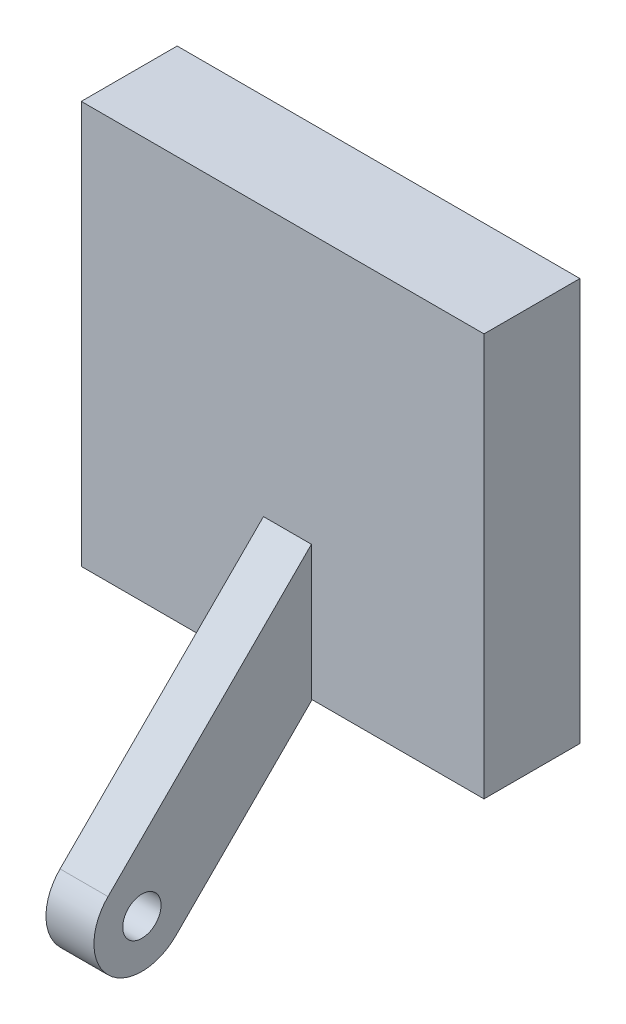
ISO-10303-21;
HEADER;
FILE_DESCRIPTION(('STEP AP214'),'2;1');
FILE_NAME('part.step','',(''),(''),'','','');
FILE_SCHEMA(('AUTOMOTIVE_DESIGN { 1 0 10303 214 1 1 1 1 }'));
ENDSEC;
DATA;
#1=APPLICATION_CONTEXT('core data for automotive mechanical design processes');
#2=APPLICATION_PROTOCOL_DEFINITION('international standard','automotive_design',2000,#1);
#3=PRODUCT_CONTEXT('',#1,'mechanical');
#4=PRODUCT('Part','Part','',(#3));
#5=PRODUCT_RELATED_PRODUCT_CATEGORY('part','',(#4));
#6=PRODUCT_DEFINITION_FORMATION('','',#4);
#7=PRODUCT_DEFINITION_CONTEXT('part definition',#1,'design');
#8=PRODUCT_DEFINITION('design','',#6,#7);
#9=PRODUCT_DEFINITION_SHAPE('','',#8);
#10=(LENGTH_UNIT() NAMED_UNIT(*) SI_UNIT(.MILLI.,.METRE.));
#11=(NAMED_UNIT(*) PLANE_ANGLE_UNIT() SI_UNIT($,.RADIAN.));
#12=(NAMED_UNIT(*) SI_UNIT($,.STERADIAN.) SOLID_ANGLE_UNIT());
#13=UNCERTAINTY_MEASURE_WITH_UNIT(LENGTH_MEASURE(1.E-05),#10,'distance_accuracy_value','');
#14=(GEOMETRIC_REPRESENTATION_CONTEXT(3) GLOBAL_UNCERTAINTY_ASSIGNED_CONTEXT((#13)) GLOBAL_UNIT_ASSIGNED_CONTEXT((#10,
#11,#12)) REPRESENTATION_CONTEXT('',''));
#15=CARTESIAN_POINT('',(0.,0.,0.));
#16=DIRECTION('',(0.,0.,1.));
#17=DIRECTION('',(1.,0.,0.));
#18=AXIS2_PLACEMENT_3D('',#15,#16,#17);
#19=CARTESIAN_POINT('',(5.,3.53553390593273,3.53553390593274));
#20=DIRECTION('',(1.,0.,0.));
#21=DIRECTION('',(0.,0.,-1.));
#22=AXIS2_PLACEMENT_3D('',#19,#20,#21);
#23=PLANE('',#22);
#24=CARTESIAN_POINT('',(5.,3.53553390593273,3.53553390593274));
#25=DIRECTION('',(1.,0.,0.));
#26=DIRECTION('',(0.,0.,-1.));
#27=AXIS2_PLACEMENT_3D('',#24,#25,#26);
#28=CIRCLE('',#27,2.);
#29=CARTESIAN_POINT('',(5.,3.53553390593273,1.53553390593274));
#30=VERTEX_POINT('',#29);
#31=EDGE_CURVE('E106',#30,#30,#28,.T.);
#32=ORIENTED_EDGE('',*,*,#31,.F.);
#33=EDGE_LOOP('',(#32));
#34=FACE_BOUND('',#33,.T.);
#35=DIRECTION('',(0.,0.,1.));
#36=VECTOR('',#35,1.);
#37=CARTESIAN_POINT('',(5.,14.2842712474619,3.53553390593274));
#38=LINE('',#37,#36);
#39=CARTESIAN_POINT('',(5.,14.2842712474619,-14.2842712474619));
#40=VERTEX_POINT('',#39);
#41=CARTESIAN_POINT('',(5.,14.2842712474619,-14.1421356237309));
#42=VERTEX_POINT('',#41);
#43=EDGE_CURVE('E132',#40,#42,#38,.T.);
#44=ORIENTED_EDGE('',*,*,#43,.T.);
#45=DIRECTION('',(0.,1.,0.));
#46=VECTOR('',#45,1.);
#47=CARTESIAN_POINT('',(5.,3.53553390593273,-14.1421356237309));
#48=LINE('',#47,#46);
#49=CARTESIAN_POINT('',(5.,28.2842712474619,-14.1421356237309));
#50=VERTEX_POINT('',#49);
#51=EDGE_CURVE('E140',#42,#50,#48,.T.);
#52=ORIENTED_EDGE('',*,*,#51,.T.);
#53=DIRECTION('',(0.,-0.707106781186549,0.707106781186546));
#54=VECTOR('',#53,1.);
#55=CARTESIAN_POINT('',(5.,28.2842712474619,-14.1421356237309));
#56=LINE('',#55,#54);
#57=CARTESIAN_POINT('',(5.,7.07106781186546,7.07106781186549));
#58=VERTEX_POINT('',#57);
#59=EDGE_CURVE('E63',#50,#58,#56,.T.);
#60=ORIENTED_EDGE('',*,*,#59,.T.);
#61=CARTESIAN_POINT('',(5.,3.53553390593273,3.53553390593274));
#62=DIRECTION('',(1.,0.,0.));
#63=DIRECTION('',(0.,0.,-1.));
#64=AXIS2_PLACEMENT_3D('',#61,#62,#63);
#65=CIRCLE('',#64,5.);
#66=CARTESIAN_POINT('',(5.,0.,0.));
#67=VERTEX_POINT('',#66);
#68=EDGE_CURVE('E92',#58,#67,#65,.T.);
#69=ORIENTED_EDGE('',*,*,#68,.T.);
#70=DIRECTION('',(0.,0.707106781186549,-0.707106781186546));
#71=VECTOR('',#70,1.);
#72=CARTESIAN_POINT('',(5.,0.,0.));
#73=LINE('',#72,#71);
#74=EDGE_CURVE('E123',#67,#40,#73,.T.);
#75=ORIENTED_EDGE('',*,*,#74,.T.);
#76=EDGE_LOOP('',(#44,#52,#60,#69,#75));
#77=FACE_BOUND('',#76,.T.);
#78=ADVANCED_FACE('F45',(#34,#77),#23,.T.);
#79=CARTESIAN_POINT('',(0.,3.53553390593273,3.53553390593274));
#80=DIRECTION('',(1.,0.,0.));
#81=DIRECTION('',(0.,0.,-1.));
#82=AXIS2_PLACEMENT_3D('',#79,#80,#81);
#83=PLANE('',#82);
#84=CARTESIAN_POINT('',(0.,3.53553390593273,3.53553390593274));
#85=DIRECTION('',(1.,0.,0.));
#86=DIRECTION('',(0.,0.,-1.));
#87=AXIS2_PLACEMENT_3D('',#84,#85,#86);
#88=CIRCLE('',#87,2.);
#89=CARTESIAN_POINT('',(0.,3.53553390593273,1.53553390593274));
#90=VERTEX_POINT('',#89);
#91=EDGE_CURVE('E112',#90,#90,#88,.T.);
#92=ORIENTED_EDGE('',*,*,#91,.T.);
#93=EDGE_LOOP('',(#92));
#94=FACE_BOUND('',#93,.T.);
#95=DIRECTION('',(0.,1.,0.));
#96=VECTOR('',#95,1.);
#97=CARTESIAN_POINT('',(0.,3.53553390593273,-14.1421356237309));
#98=LINE('',#97,#96);
#99=CARTESIAN_POINT('',(0.,14.2842712474619,-14.1421356237309));
#100=VERTEX_POINT('',#99);
#101=CARTESIAN_POINT('',(0.,28.2842712474619,-14.1421356237309));
#102=VERTEX_POINT('',#101);
#103=EDGE_CURVE('E78',#100,#102,#98,.T.);
#104=ORIENTED_EDGE('',*,*,#103,.F.);
#105=DIRECTION('',(0.,0.,1.));
#106=VECTOR('',#105,1.);
#107=CARTESIAN_POINT('',(0.,14.2842712474619,3.53553390593274));
#108=LINE('',#107,#106);
#109=CARTESIAN_POINT('',(0.,14.2842712474619,-14.2842712474619));
#110=VERTEX_POINT('',#109);
#111=EDGE_CURVE('E136',#110,#100,#108,.T.);
#112=ORIENTED_EDGE('',*,*,#111,.F.);
#113=DIRECTION('',(0.,0.707106781186549,-0.707106781186546));
#114=VECTOR('',#113,1.);
#115=CARTESIAN_POINT('',(0.,0.,0.));
#116=LINE('',#115,#114);
#117=CARTESIAN_POINT('',(0.,0.,0.));
#118=VERTEX_POINT('',#117);
#119=EDGE_CURVE('E93',#118,#110,#116,.T.);
#120=ORIENTED_EDGE('',*,*,#119,.F.);
#121=CARTESIAN_POINT('',(0.,3.53553390593273,3.53553390593274));
#122=DIRECTION('',(1.,0.,0.));
#123=DIRECTION('',(0.,0.,-1.));
#124=AXIS2_PLACEMENT_3D('',#121,#122,#123);
#125=CIRCLE('',#124,5.);
#126=CARTESIAN_POINT('',(0.,7.07106781186546,7.07106781186549));
#127=VERTEX_POINT('',#126);
#128=EDGE_CURVE('E98',#127,#118,#125,.T.);
#129=ORIENTED_EDGE('',*,*,#128,.F.);
#130=DIRECTION('',(0.,-0.707106781186549,0.707106781186546));
#131=VECTOR('',#130,1.);
#132=CARTESIAN_POINT('',(0.,28.2842712474619,-14.1421356237309));
#133=LINE('',#132,#131);
#134=EDGE_CURVE('E83',#102,#127,#133,.T.);
#135=ORIENTED_EDGE('',*,*,#134,.F.);
#136=EDGE_LOOP('',(#104,#112,#120,#129,#135));
#137=FACE_BOUND('',#136,.T.);
#138=ADVANCED_FACE('F101',(#94,#137),#83,.F.);
#139=CARTESIAN_POINT('',(5.,0.,0.));
#140=DIRECTION('',(0.,0.707106781186546,0.707106781186549));
#141=DIRECTION('',(0.,-0.707106781186549,0.707106781186546));
#142=AXIS2_PLACEMENT_3D('',#139,#140,#141);
#143=PLANE('',#142);
#144=DIRECTION('',(-1.,0.,0.));
#145=VECTOR('',#144,1.);
#146=CARTESIAN_POINT('',(5.,14.2842712474619,-14.2842712474619));
#147=LINE('',#146,#145);
#148=EDGE_CURVE('E11',#40,#110,#147,.T.);
#149=ORIENTED_EDGE('',*,*,#148,.F.);
#150=ORIENTED_EDGE('',*,*,#74,.F.);
#151=DIRECTION('',(-1.,0.,0.));
#152=VECTOR('',#151,1.);
#153=CARTESIAN_POINT('',(5.,0.,0.));
#154=LINE('',#153,#152);
#155=EDGE_CURVE('E55',#67,#118,#154,.T.);
#156=ORIENTED_EDGE('',*,*,#155,.T.);
#157=ORIENTED_EDGE('',*,*,#119,.T.);
#158=EDGE_LOOP('',(#149,#150,#156,#157));
#159=FACE_BOUND('',#158,.T.);
#160=ADVANCED_FACE('F121',(#159),#143,.F.);
#161=CARTESIAN_POINT('',(5.,3.53553390593273,3.53553390593274));
#162=DIRECTION('',(-1.,0.,0.));
#163=DIRECTION('',(0.,0.,1.));
#164=AXIS2_PLACEMENT_3D('',#161,#162,#163);
#165=CYLINDRICAL_SURFACE('',#164,5.);
#166=ORIENTED_EDGE('',*,*,#128,.T.);
#167=ORIENTED_EDGE('',*,*,#155,.F.);
#168=ORIENTED_EDGE('',*,*,#68,.F.);
#169=DIRECTION('',(-1.,0.,0.));
#170=VECTOR('',#169,1.);
#171=CARTESIAN_POINT('',(5.,7.07106781186546,7.07106781186549));
#172=LINE('',#171,#170);
#173=EDGE_CURVE('E86',#58,#127,#172,.T.);
#174=ORIENTED_EDGE('',*,*,#173,.T.);
#175=EDGE_LOOP('',(#166,#167,#168,#174));
#176=FACE_BOUND('',#175,.T.);
#177=ADVANCED_FACE('F47',(#176),#165,.T.);
#178=CARTESIAN_POINT('',(5.,28.2842712474619,-14.1421356237309));
#179=DIRECTION('',(0.,-0.707106781186546,-0.707106781186549));
#180=DIRECTION('',(0.,0.707106781186549,-0.707106781186546));
#181=AXIS2_PLACEMENT_3D('',#178,#179,#180);
#182=PLANE('',#181);
#183=ORIENTED_EDGE('',*,*,#134,.T.);
#184=ORIENTED_EDGE('',*,*,#173,.F.);
#185=ORIENTED_EDGE('',*,*,#59,.F.);
#186=DIRECTION('',(-1.,0.,0.));
#187=VECTOR('',#186,1.);
#188=CARTESIAN_POINT('',(5.,28.2842712474619,-14.1421356237309));
#189=LINE('',#188,#187);
#190=EDGE_CURVE('E88',#50,#102,#189,.T.);
#191=ORIENTED_EDGE('',*,*,#190,.T.);
#192=EDGE_LOOP('',(#183,#184,#185,#191));
#193=FACE_BOUND('',#192,.T.);
#194=ADVANCED_FACE('F85',(#193),#182,.F.);
#195=CARTESIAN_POINT('',(5.,3.53553390593273,3.53553390593274));
#196=DIRECTION('',(-1.,0.,0.));
#197=DIRECTION('',(0.,0.,1.));
#198=AXIS2_PLACEMENT_3D('',#195,#196,#197);
#199=CYLINDRICAL_SURFACE('',#198,2.);
#200=ORIENTED_EDGE('',*,*,#31,.T.);
#201=EDGE_LOOP('',(#200));
#202=FACE_BOUND('',#201,.T.);
#203=ORIENTED_EDGE('',*,*,#91,.F.);
#204=EDGE_LOOP('',(#203));
#205=FACE_BOUND('',#204,.T.);
#206=ADVANCED_FACE('F263',(#202,#205),#199,.F.);
#207=CARTESIAN_POINT('',(23.,56.2842712474619,-14.1421356237309));
#208=DIRECTION('',(0.,0.,-1.));
#209=DIRECTION('',(-1.,0.,0.));
#210=AXIS2_PLACEMENT_3D('',#207,#208,#209);
#211=PLANE('',#210);
#212=ORIENTED_EDGE('',*,*,#51,.F.);
#213=DIRECTION('',(-1.,0.,0.));
#214=VECTOR('',#213,1.);
#215=CARTESIAN_POINT('',(23.,14.2842712474619,-14.1421356237309));
#216=LINE('',#215,#214);
#217=CARTESIAN_POINT('',(23.,14.2842712474619,-14.1421356237309));
#218=VERTEX_POINT('',#217);
#219=EDGE_CURVE('E145',#218,#42,#216,.T.);
#220=ORIENTED_EDGE('',*,*,#219,.F.);
#221=DIRECTION('',(0.,-1.,0.));
#222=VECTOR('',#221,1.);
#223=CARTESIAN_POINT('',(23.,56.2842712474619,-14.1421356237309));
#224=LINE('',#223,#222);
#225=CARTESIAN_POINT('',(23.,56.2842712474619,-14.1421356237309));
#226=VERTEX_POINT('',#225);
#227=EDGE_CURVE('E174',#226,#218,#224,.T.);
#228=ORIENTED_EDGE('',*,*,#227,.F.);
#229=DIRECTION('',(-1.,0.,0.));
#230=VECTOR('',#229,1.);
#231=CARTESIAN_POINT('',(23.,56.2842712474619,-14.1421356237309));
#232=LINE('',#231,#230);
#233=CARTESIAN_POINT('',(-19.,56.2842712474619,-14.1421356237309));
#234=VERTEX_POINT('',#233);
#235=EDGE_CURVE('E158',#226,#234,#232,.T.);
#236=ORIENTED_EDGE('',*,*,#235,.T.);
#237=DIRECTION('',(0.,-1.,0.));
#238=VECTOR('',#237,1.);
#239=CARTESIAN_POINT('',(-19.,56.2842712474619,-14.1421356237309));
#240=LINE('',#239,#238);
#241=CARTESIAN_POINT('',(-19.,14.2842712474619,-14.1421356237309));
#242=VERTEX_POINT('',#241);
#243=EDGE_CURVE('E190',#234,#242,#240,.T.);
#244=ORIENTED_EDGE('',*,*,#243,.T.);
#245=EDGE_CURVE('E149',#100,#242,#216,.T.);
#246=ORIENTED_EDGE('',*,*,#245,.F.);
#247=ORIENTED_EDGE('',*,*,#103,.T.);
#248=ORIENTED_EDGE('',*,*,#190,.F.);
#249=EDGE_LOOP('',(#212,#220,#228,#236,#244,#246,#247,#248));
#250=FACE_BOUND('',#249,.T.);
#251=ADVANCED_FACE('F196',(#250),#211,.F.);
#252=CARTESIAN_POINT('',(23.,14.2842712474619,-14.1421356237309));
#253=DIRECTION('',(0.,1.,0.));
#254=DIRECTION('',(0.,0.,1.));
#255=AXIS2_PLACEMENT_3D('',#252,#253,#254);
#256=PLANE('',#255);
#257=ORIENTED_EDGE('',*,*,#43,.F.);
#258=ORIENTED_EDGE('',*,*,#148,.T.);
#259=ORIENTED_EDGE('',*,*,#111,.T.);
#260=ORIENTED_EDGE('',*,*,#245,.T.);
#261=DIRECTION('',(0.,0.,-1.));
#262=VECTOR('',#261,1.);
#263=CARTESIAN_POINT('',(-19.,14.2842712474619,-14.1421356237309));
#264=LINE('',#263,#262);
#265=CARTESIAN_POINT('',(-19.,14.2842712474619,-24.1421356237309));
#266=VERTEX_POINT('',#265);
#267=EDGE_CURVE('E186',#242,#266,#264,.T.);
#268=ORIENTED_EDGE('',*,*,#267,.T.);
#269=DIRECTION('',(-1.,0.,0.));
#270=VECTOR('',#269,1.);
#271=CARTESIAN_POINT('',(23.,14.2842712474619,-24.1421356237309));
#272=LINE('',#271,#270);
#273=CARTESIAN_POINT('',(23.,14.2842712474619,-24.1421356237309));
#274=VERTEX_POINT('',#273);
#275=EDGE_CURVE('E150',#274,#266,#272,.T.);
#276=ORIENTED_EDGE('',*,*,#275,.F.);
#277=DIRECTION('',(0.,0.,-1.));
#278=VECTOR('',#277,1.);
#279=CARTESIAN_POINT('',(23.,14.2842712474619,-14.1421356237309));
#280=LINE('',#279,#278);
#281=EDGE_CURVE('E170',#218,#274,#280,.T.);
#282=ORIENTED_EDGE('',*,*,#281,.F.);
#283=ORIENTED_EDGE('',*,*,#219,.T.);
#284=EDGE_LOOP('',(#257,#258,#259,#260,#268,#276,#282,#283));
#285=FACE_BOUND('',#284,.T.);
#286=ADVANCED_FACE('F226',(#285),#256,.F.);
#287=CARTESIAN_POINT('',(23.,56.2842712474619,-24.1421356237309));
#288=DIRECTION('',(0.,0.,1.));
#289=DIRECTION('',(1.,0.,0.));
#290=AXIS2_PLACEMENT_3D('',#287,#288,#289);
#291=PLANE('',#290);
#292=ORIENTED_EDGE('',*,*,#275,.T.);
#293=DIRECTION('',(0.,1.,0.));
#294=VECTOR('',#293,1.);
#295=CARTESIAN_POINT('',(-19.,56.2842712474619,-24.1421356237309));
#296=LINE('',#295,#294);
#297=CARTESIAN_POINT('',(-19.,56.2842712474619,-24.1421356237309));
#298=VERTEX_POINT('',#297);
#299=EDGE_CURVE('E182',#266,#298,#296,.T.);
#300=ORIENTED_EDGE('',*,*,#299,.T.);
#301=DIRECTION('',(-1.,0.,0.));
#302=VECTOR('',#301,1.);
#303=CARTESIAN_POINT('',(23.,56.2842712474619,-24.1421356237309));
#304=LINE('',#303,#302);
#305=CARTESIAN_POINT('',(23.,56.2842712474619,-24.1421356237309));
#306=VERTEX_POINT('',#305);
#307=EDGE_CURVE('E154',#306,#298,#304,.T.);
#308=ORIENTED_EDGE('',*,*,#307,.F.);
#309=DIRECTION('',(0.,1.,0.));
#310=VECTOR('',#309,1.);
#311=CARTESIAN_POINT('',(23.,56.2842712474619,-24.1421356237309));
#312=LINE('',#311,#310);
#313=EDGE_CURVE('E166',#274,#306,#312,.T.);
#314=ORIENTED_EDGE('',*,*,#313,.F.);
#315=EDGE_LOOP('',(#292,#300,#308,#314));
#316=FACE_BOUND('',#315,.T.);
#317=ADVANCED_FACE('F221',(#316),#291,.F.);
#318=CARTESIAN_POINT('',(23.,56.2842712474619,-14.1421356237309));
#319=DIRECTION('',(0.,-1.,0.));
#320=DIRECTION('',(0.,0.,-1.));
#321=AXIS2_PLACEMENT_3D('',#318,#319,#320);
#322=PLANE('',#321);
#323=ORIENTED_EDGE('',*,*,#307,.T.);
#324=DIRECTION('',(0.,0.,1.));
#325=VECTOR('',#324,1.);
#326=CARTESIAN_POINT('',(-19.,56.2842712474619,-14.1421356237309));
#327=LINE('',#326,#325);
#328=EDGE_CURVE('E178',#298,#234,#327,.T.);
#329=ORIENTED_EDGE('',*,*,#328,.T.);
#330=ORIENTED_EDGE('',*,*,#235,.F.);
#331=DIRECTION('',(0.,0.,1.));
#332=VECTOR('',#331,1.);
#333=CARTESIAN_POINT('',(23.,56.2842712474619,-14.1421356237309));
#334=LINE('',#333,#332);
#335=EDGE_CURVE('E162',#306,#226,#334,.T.);
#336=ORIENTED_EDGE('',*,*,#335,.F.);
#337=EDGE_LOOP('',(#323,#329,#330,#336));
#338=FACE_BOUND('',#337,.T.);
#339=ADVANCED_FACE('F213',(#338),#322,.F.);
#340=CARTESIAN_POINT('',(23.,0.,0.));
#341=DIRECTION('',(1.,0.,0.));
#342=DIRECTION('',(0.,0.,-1.));
#343=AXIS2_PLACEMENT_3D('',#340,#341,#342);
#344=PLANE('',#343);
#345=ORIENTED_EDGE('',*,*,#227,.T.);
#346=ORIENTED_EDGE('',*,*,#281,.T.);
#347=ORIENTED_EDGE('',*,*,#313,.T.);
#348=ORIENTED_EDGE('',*,*,#335,.T.);
#349=EDGE_LOOP('',(#345,#346,#347,#348));
#350=FACE_BOUND('',#349,.T.);
#351=ADVANCED_FACE('F242',(#350),#344,.T.);
#352=CARTESIAN_POINT('',(-19.,0.,0.));
#353=DIRECTION('',(1.,0.,0.));
#354=DIRECTION('',(0.,0.,-1.));
#355=AXIS2_PLACEMENT_3D('',#352,#353,#354);
#356=PLANE('',#355);
#357=ORIENTED_EDGE('',*,*,#243,.F.);
#358=ORIENTED_EDGE('',*,*,#328,.F.);
#359=ORIENTED_EDGE('',*,*,#299,.F.);
#360=ORIENTED_EDGE('',*,*,#267,.F.);
#361=EDGE_LOOP('',(#357,#358,#359,#360));
#362=FACE_BOUND('',#361,.T.);
#363=ADVANCED_FACE('F207',(#362),#356,.F.);
#364=CLOSED_SHELL('',(#78,#138,#160,#177,#194,#206,#251,#286,#317,#339,#351,#363));
#365=MANIFOLD_SOLID_BREP('B2',#364);
#366=ADVANCED_BREP_SHAPE_REPRESENTATION('',(#18,#365),#14);
#367=SHAPE_DEFINITION_REPRESENTATION(#9,#366);
ENDSEC;
END-ISO-10303-21;
